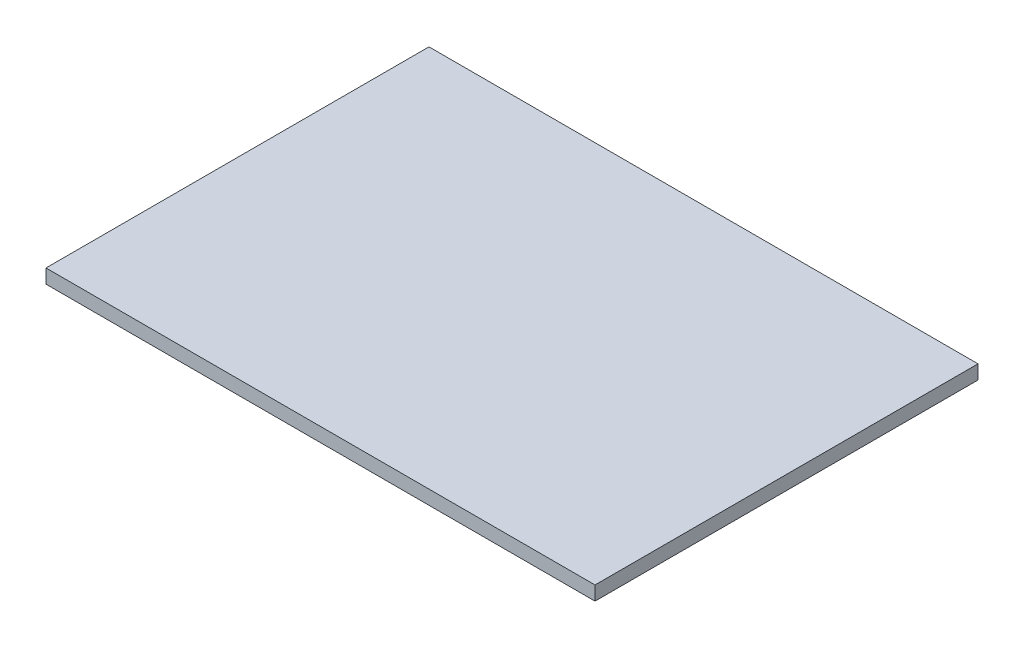
ISO-10303-21;
HEADER;
FILE_DESCRIPTION(('STEP AP214'),'2;1');
FILE_NAME('part.step','',(''),(''),'','','');
FILE_SCHEMA(('AUTOMOTIVE_DESIGN { 1 0 10303 214 1 1 1 1 }'));
ENDSEC;
DATA;
#1=APPLICATION_CONTEXT('core data for automotive mechanical design processes');
#2=APPLICATION_PROTOCOL_DEFINITION('international standard','automotive_design',2000,#1);
#3=PRODUCT_CONTEXT('',#1,'mechanical');
#4=PRODUCT('Part','Part','',(#3));
#5=PRODUCT_RELATED_PRODUCT_CATEGORY('part','',(#4));
#6=PRODUCT_DEFINITION_FORMATION('','',#4);
#7=PRODUCT_DEFINITION_CONTEXT('part definition',#1,'design');
#8=PRODUCT_DEFINITION('design','',#6,#7);
#9=PRODUCT_DEFINITION_SHAPE('','',#8);
#10=(LENGTH_UNIT() NAMED_UNIT(*) SI_UNIT(.MILLI.,.METRE.));
#11=(NAMED_UNIT(*) PLANE_ANGLE_UNIT() SI_UNIT($,.RADIAN.));
#12=(NAMED_UNIT(*) SI_UNIT($,.STERADIAN.) SOLID_ANGLE_UNIT());
#13=UNCERTAINTY_MEASURE_WITH_UNIT(LENGTH_MEASURE(1.E-05),#10,'distance_accuracy_value','');
#14=(GEOMETRIC_REPRESENTATION_CONTEXT(3) GLOBAL_UNCERTAINTY_ASSIGNED_CONTEXT((#13)) GLOBAL_UNIT_ASSIGNED_CONTEXT((#10,
#11,#12)) REPRESENTATION_CONTEXT('',''));
#15=CARTESIAN_POINT('',(0.,0.,0.));
#16=DIRECTION('',(0.,0.,1.));
#17=DIRECTION('',(1.,0.,0.));
#18=AXIS2_PLACEMENT_3D('',#15,#16,#17);
#19=CARTESIAN_POINT('',(102.,12.7,-77.));
#20=DIRECTION('',(1.,0.,0.));
#21=DIRECTION('',(0.,0.,-1.));
#22=AXIS2_PLACEMENT_3D('',#19,#20,#21);
#23=PLANE('',#22);
#24=DIRECTION('',(0.,0.,1.));
#25=VECTOR('',#24,1.);
#26=CARTESIAN_POINT('',(102.,0.,-77.));
#27=LINE('',#26,#25);
#28=CARTESIAN_POINT('',(102.,0.,-423.));
#29=VERTEX_POINT('',#28);
#30=CARTESIAN_POINT('',(102.,0.,-77.));
#31=VERTEX_POINT('',#30);
#32=EDGE_CURVE('E95',#29,#31,#27,.T.);
#33=ORIENTED_EDGE('',*,*,#32,.T.);
#34=DIRECTION('',(0.,-1.,0.));
#35=VECTOR('',#34,1.);
#36=CARTESIAN_POINT('',(102.,12.7,-77.));
#37=LINE('',#36,#35);
#38=CARTESIAN_POINT('',(102.,12.7,-77.));
#39=VERTEX_POINT('',#38);
#40=EDGE_CURVE('E11',#39,#31,#37,.T.);
#41=ORIENTED_EDGE('',*,*,#40,.F.);
#42=DIRECTION('',(0.,0.,1.));
#43=VECTOR('',#42,1.);
#44=CARTESIAN_POINT('',(102.,12.7,-77.));
#45=LINE('',#44,#43);
#46=CARTESIAN_POINT('',(102.,12.7,-423.));
#47=VERTEX_POINT('',#46);
#48=EDGE_CURVE('E83',#47,#39,#45,.T.);
#49=ORIENTED_EDGE('',*,*,#48,.F.);
#50=DIRECTION('',(0.,-1.,0.));
#51=VECTOR('',#50,1.);
#52=CARTESIAN_POINT('',(102.,12.7,-423.));
#53=LINE('',#52,#51);
#54=EDGE_CURVE('E91',#47,#29,#53,.T.);
#55=ORIENTED_EDGE('',*,*,#54,.T.);
#56=EDGE_LOOP('',(#33,#41,#49,#55));
#57=FACE_BOUND('',#56,.T.);
#58=ADVANCED_FACE('F32',(#57),#23,.F.);
#59=CARTESIAN_POINT('',(102.,12.7,-77.));
#60=DIRECTION('',(0.,0.,-1.));
#61=DIRECTION('',(-1.,0.,0.));
#62=AXIS2_PLACEMENT_3D('',#59,#60,#61);
#63=PLANE('',#62);
#64=DIRECTION('',(1.,0.,0.));
#65=VECTOR('',#64,1.);
#66=CARTESIAN_POINT('',(102.,0.,-77.));
#67=LINE('',#66,#65);
#68=CARTESIAN_POINT('',(598.,0.,-77.));
#69=VERTEX_POINT('',#68);
#70=EDGE_CURVE('E87',#31,#69,#67,.T.);
#71=ORIENTED_EDGE('',*,*,#70,.T.);
#72=DIRECTION('',(0.,-1.,0.));
#73=VECTOR('',#72,1.);
#74=CARTESIAN_POINT('',(598.,12.7,-77.));
#75=LINE('',#74,#73);
#76=CARTESIAN_POINT('',(598.,12.7,-77.));
#77=VERTEX_POINT('',#76);
#78=EDGE_CURVE('E40',#77,#69,#75,.T.);
#79=ORIENTED_EDGE('',*,*,#78,.F.);
#80=DIRECTION('',(1.,0.,0.));
#81=VECTOR('',#80,1.);
#82=CARTESIAN_POINT('',(102.,12.7,-77.));
#83=LINE('',#82,#81);
#84=EDGE_CURVE('E78',#39,#77,#83,.T.);
#85=ORIENTED_EDGE('',*,*,#84,.F.);
#86=ORIENTED_EDGE('',*,*,#40,.T.);
#87=EDGE_LOOP('',(#71,#79,#85,#86));
#88=FACE_BOUND('',#87,.T.);
#89=ADVANCED_FACE('F86',(#88),#63,.F.);
#90=CARTESIAN_POINT('',(598.,12.7,-77.));
#91=DIRECTION('',(-1.,0.,0.));
#92=DIRECTION('',(0.,0.,1.));
#93=AXIS2_PLACEMENT_3D('',#90,#91,#92);
#94=PLANE('',#93);
#95=DIRECTION('',(0.,0.,-1.));
#96=VECTOR('',#95,1.);
#97=CARTESIAN_POINT('',(598.,0.,-77.));
#98=LINE('',#97,#96);
#99=CARTESIAN_POINT('',(598.,0.,-423.));
#100=VERTEX_POINT('',#99);
#101=EDGE_CURVE('E65',#69,#100,#98,.T.);
#102=ORIENTED_EDGE('',*,*,#101,.T.);
#103=DIRECTION('',(0.,-1.,0.));
#104=VECTOR('',#103,1.);
#105=CARTESIAN_POINT('',(598.,12.7,-423.));
#106=LINE('',#105,#104);
#107=CARTESIAN_POINT('',(598.,12.7,-423.));
#108=VERTEX_POINT('',#107);
#109=EDGE_CURVE('E88',#108,#100,#106,.T.);
#110=ORIENTED_EDGE('',*,*,#109,.F.);
#111=DIRECTION('',(0.,0.,-1.));
#112=VECTOR('',#111,1.);
#113=CARTESIAN_POINT('',(598.,12.7,-77.));
#114=LINE('',#113,#112);
#115=EDGE_CURVE('E81',#77,#108,#114,.T.);
#116=ORIENTED_EDGE('',*,*,#115,.F.);
#117=ORIENTED_EDGE('',*,*,#78,.T.);
#118=EDGE_LOOP('',(#102,#110,#116,#117));
#119=FACE_BOUND('',#118,.T.);
#120=ADVANCED_FACE('F89',(#119),#94,.F.);
#121=CARTESIAN_POINT('',(102.,12.7,-423.));
#122=DIRECTION('',(0.,0.,1.));
#123=DIRECTION('',(1.,0.,0.));
#124=AXIS2_PLACEMENT_3D('',#121,#122,#123);
#125=PLANE('',#124);
#126=DIRECTION('',(-1.,0.,0.));
#127=VECTOR('',#126,1.);
#128=CARTESIAN_POINT('',(102.,0.,-423.));
#129=LINE('',#128,#127);
#130=EDGE_CURVE('E71',#100,#29,#129,.T.);
#131=ORIENTED_EDGE('',*,*,#130,.T.);
#132=ORIENTED_EDGE('',*,*,#54,.F.);
#133=DIRECTION('',(-1.,0.,0.));
#134=VECTOR('',#133,1.);
#135=CARTESIAN_POINT('',(102.,12.7,-423.));
#136=LINE('',#135,#134);
#137=EDGE_CURVE('E48',#108,#47,#136,.T.);
#138=ORIENTED_EDGE('',*,*,#137,.F.);
#139=ORIENTED_EDGE('',*,*,#109,.T.);
#140=EDGE_LOOP('',(#131,#132,#138,#139));
#141=FACE_BOUND('',#140,.T.);
#142=ADVANCED_FACE('F102',(#141),#125,.F.);
#143=CARTESIAN_POINT('',(0.,12.7,0.));
#144=DIRECTION('',(0.,-1.,0.));
#145=DIRECTION('',(0.,0.,-1.));
#146=AXIS2_PLACEMENT_3D('',#143,#144,#145);
#147=PLANE('',#146);
#148=ORIENTED_EDGE('',*,*,#48,.T.);
#149=ORIENTED_EDGE('',*,*,#84,.T.);
#150=ORIENTED_EDGE('',*,*,#115,.T.);
#151=ORIENTED_EDGE('',*,*,#137,.T.);
#152=EDGE_LOOP('',(#148,#149,#150,#151));
#153=FACE_BOUND('',#152,.T.);
#154=ADVANCED_FACE('F79',(#153),#147,.F.);
#155=CARTESIAN_POINT('',(0.,0.,0.));
#156=DIRECTION('',(0.,-1.,0.));
#157=DIRECTION('',(0.,0.,-1.));
#158=AXIS2_PLACEMENT_3D('',#155,#156,#157);
#159=PLANE('',#158);
#160=ORIENTED_EDGE('',*,*,#32,.F.);
#161=ORIENTED_EDGE('',*,*,#130,.F.);
#162=ORIENTED_EDGE('',*,*,#101,.F.);
#163=ORIENTED_EDGE('',*,*,#70,.F.);
#164=EDGE_LOOP('',(#160,#161,#162,#163));
#165=FACE_BOUND('',#164,.T.);
#166=ADVANCED_FACE('F105',(#165),#159,.T.);
#167=CLOSED_SHELL('',(#58,#89,#120,#142,#154,#166));
#168=MANIFOLD_SOLID_BREP('B2',#167);
#169=ADVANCED_BREP_SHAPE_REPRESENTATION('',(#18,#168),#14);
#170=SHAPE_DEFINITION_REPRESENTATION(#9,#169);
ENDSEC;
END-ISO-10303-21;
